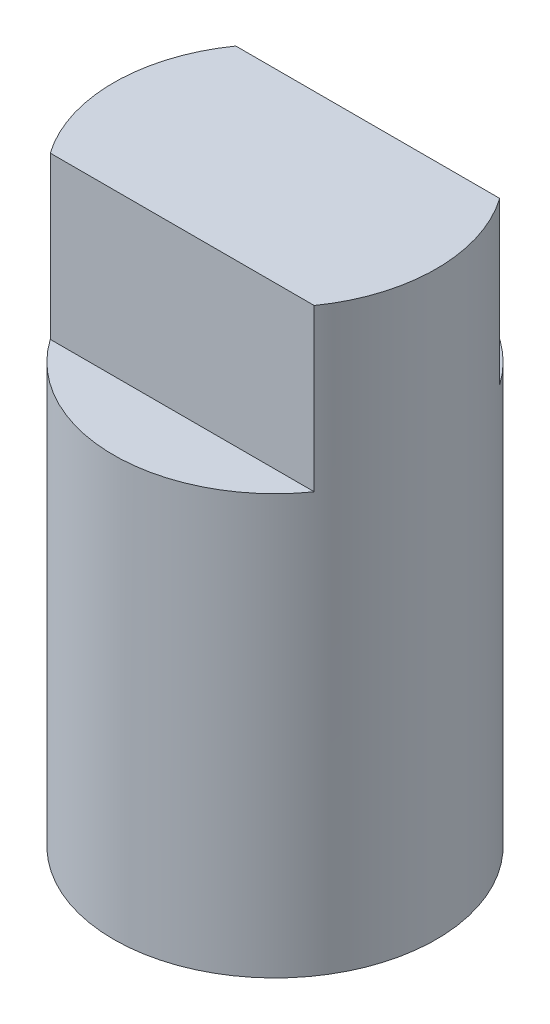
ISO-10303-21;
HEADER;
FILE_DESCRIPTION(('STEP AP214'),'2;1');
FILE_NAME('part.step','',(''),(''),'','','');
FILE_SCHEMA(('AUTOMOTIVE_DESIGN { 1 0 10303 214 1 1 1 1 }'));
ENDSEC;
DATA;
#1=APPLICATION_CONTEXT('core data for automotive mechanical design processes');
#2=APPLICATION_PROTOCOL_DEFINITION('international standard','automotive_design',2000,#1);
#3=PRODUCT_CONTEXT('',#1,'mechanical');
#4=PRODUCT('Part','Part','',(#3));
#5=PRODUCT_RELATED_PRODUCT_CATEGORY('part','',(#4));
#6=PRODUCT_DEFINITION_FORMATION('','',#4);
#7=PRODUCT_DEFINITION_CONTEXT('part definition',#1,'design');
#8=PRODUCT_DEFINITION('design','',#6,#7);
#9=PRODUCT_DEFINITION_SHAPE('','',#8);
#10=(LENGTH_UNIT() NAMED_UNIT(*) SI_UNIT(.MILLI.,.METRE.));
#11=(NAMED_UNIT(*) PLANE_ANGLE_UNIT() SI_UNIT($,.RADIAN.));
#12=(NAMED_UNIT(*) SI_UNIT($,.STERADIAN.) SOLID_ANGLE_UNIT());
#13=UNCERTAINTY_MEASURE_WITH_UNIT(LENGTH_MEASURE(1.E-05),#10,'distance_accuracy_value','');
#14=(GEOMETRIC_REPRESENTATION_CONTEXT(3) GLOBAL_UNCERTAINTY_ASSIGNED_CONTEXT((#13)) GLOBAL_UNIT_ASSIGNED_CONTEXT((#10,
#11,#12)) REPRESENTATION_CONTEXT('',''));
#15=CARTESIAN_POINT('',(0.,0.,0.));
#16=DIRECTION('',(0.,0.,1.));
#17=DIRECTION('',(1.,0.,0.));
#18=AXIS2_PLACEMENT_3D('',#15,#16,#17);
#19=CARTESIAN_POINT('',(0.,91.44,0.));
#20=DIRECTION('',(0.,-1.,0.));
#21=DIRECTION('',(0.,0.,-1.));
#22=AXIS2_PLACEMENT_3D('',#19,#20,#21);
#23=CYLINDRICAL_SURFACE('',#22,25.4);
#24=CARTESIAN_POINT('',(0.,91.44,0.));
#25=DIRECTION('',(0.,1.,0.));
#26=DIRECTION('',(0.,0.,1.));
#27=AXIS2_PLACEMENT_3D('',#24,#25,#26);
#28=CIRCLE('',#27,25.4);
#29=CARTESIAN_POINT('',(20.781096578381,91.44,14.605));
#30=VERTEX_POINT('',#29);
#31=CARTESIAN_POINT('',(20.781096578381,91.44,-14.605));
#32=VERTEX_POINT('',#31);
#33=EDGE_CURVE('E11',#30,#32,#28,.T.);
#34=ORIENTED_EDGE('',*,*,#33,.F.);
#35=DIRECTION('',(0.,-1.,0.));
#36=VECTOR('',#35,1.);
#37=CARTESIAN_POINT('',(20.781096578381,91.44,14.605));
#38=LINE('',#37,#36);
#39=CARTESIAN_POINT('',(20.781096578381,66.04,14.605));
#40=VERTEX_POINT('',#39);
#41=EDGE_CURVE('E62',#40,#30,#38,.F.);
#42=ORIENTED_EDGE('',*,*,#41,.F.);
#43=CARTESIAN_POINT('',(0.,66.04,0.));
#44=DIRECTION('',(0.,-1.,0.));
#45=DIRECTION('',(0.,0.,-1.));
#46=AXIS2_PLACEMENT_3D('',#43,#44,#45);
#47=CIRCLE('',#46,25.4);
#48=CARTESIAN_POINT('',(-20.781096578381,66.04,14.605));
#49=VERTEX_POINT('',#48);
#50=EDGE_CURVE('E93',#49,#40,#47,.F.);
#51=ORIENTED_EDGE('',*,*,#50,.F.);
#52=DIRECTION('',(0.,-1.,0.));
#53=VECTOR('',#52,1.);
#54=CARTESIAN_POINT('',(-20.781096578381,91.44,14.605));
#55=LINE('',#54,#53);
#56=CARTESIAN_POINT('',(-20.781096578381,91.44,14.605));
#57=VERTEX_POINT('',#56);
#58=EDGE_CURVE('E83',#57,#49,#55,.T.);
#59=ORIENTED_EDGE('',*,*,#58,.F.);
#60=CARTESIAN_POINT('',(-20.781096578381,91.44,-14.605));
#61=VERTEX_POINT('',#60);
#62=EDGE_CURVE('E47',#61,#57,#28,.T.);
#63=ORIENTED_EDGE('',*,*,#62,.F.);
#64=DIRECTION('',(0.,-1.,0.));
#65=VECTOR('',#64,1.);
#66=CARTESIAN_POINT('',(-20.781096578381,91.44,-14.605));
#67=LINE('',#66,#65);
#68=CARTESIAN_POINT('',(-20.781096578381,66.04,-14.605));
#69=VERTEX_POINT('',#68);
#70=EDGE_CURVE('E54',#69,#61,#67,.F.);
#71=ORIENTED_EDGE('',*,*,#70,.F.);
#72=CARTESIAN_POINT('',(0.,66.04,0.));
#73=DIRECTION('',(0.,-1.,0.));
#74=DIRECTION('',(0.,0.,-1.));
#75=AXIS2_PLACEMENT_3D('',#72,#73,#74);
#76=CIRCLE('',#75,25.4);
#77=CARTESIAN_POINT('',(20.781096578381,66.04,-14.605));
#78=VERTEX_POINT('',#77);
#79=EDGE_CURVE('E105',#78,#69,#76,.F.);
#80=ORIENTED_EDGE('',*,*,#79,.F.);
#81=DIRECTION('',(0.,-1.,0.));
#82=VECTOR('',#81,1.);
#83=CARTESIAN_POINT('',(20.781096578381,91.44,-14.605));
#84=LINE('',#83,#82);
#85=EDGE_CURVE('E99',#32,#78,#84,.T.);
#86=ORIENTED_EDGE('',*,*,#85,.F.);
#87=EDGE_LOOP('',(#34,#42,#51,#59,#63,#71,#80,#86));
#88=FACE_BOUND('',#87,.T.);
#89=CARTESIAN_POINT('',(0.,0.,0.));
#90=DIRECTION('',(0.,1.,0.));
#91=DIRECTION('',(0.,0.,1.));
#92=AXIS2_PLACEMENT_3D('',#89,#90,#91);
#93=CIRCLE('',#92,25.4);
#94=CARTESIAN_POINT('',(0.,0.,25.4));
#95=VERTEX_POINT('',#94);
#96=EDGE_CURVE('E42',#95,#95,#93,.T.);
#97=ORIENTED_EDGE('',*,*,#96,.T.);
#98=EDGE_LOOP('',(#97));
#99=FACE_BOUND('',#98,.T.);
#100=ADVANCED_FACE('F39',(#88,#99),#23,.T.);
#101=CARTESIAN_POINT('',(0.,91.44,0.));
#102=DIRECTION('',(0.,1.,0.));
#103=DIRECTION('',(0.,0.,1.));
#104=AXIS2_PLACEMENT_3D('',#101,#102,#103);
#105=PLANE('',#104);
#106=DIRECTION('',(1.,0.,0.));
#107=VECTOR('',#106,1.);
#108=CARTESIAN_POINT('',(-25.401,91.44,14.605));
#109=LINE('',#108,#107);
#110=EDGE_CURVE('E80',#57,#30,#109,.T.);
#111=ORIENTED_EDGE('',*,*,#110,.T.);
#112=ORIENTED_EDGE('',*,*,#33,.T.);
#113=DIRECTION('',(1.,0.,0.));
#114=VECTOR('',#113,1.);
#115=CARTESIAN_POINT('',(-25.401,91.44,-14.605));
#116=LINE('',#115,#114);
#117=EDGE_CURVE('E96',#61,#32,#116,.T.);
#118=ORIENTED_EDGE('',*,*,#117,.F.);
#119=ORIENTED_EDGE('',*,*,#62,.T.);
#120=EDGE_LOOP('',(#111,#112,#118,#119));
#121=FACE_BOUND('',#120,.T.);
#122=ADVANCED_FACE('F95',(#121),#105,.T.);
#123=CARTESIAN_POINT('',(0.,0.,0.));
#124=DIRECTION('',(0.,1.,0.));
#125=DIRECTION('',(0.,0.,1.));
#126=AXIS2_PLACEMENT_3D('',#123,#124,#125);
#127=PLANE('',#126);
#128=ORIENTED_EDGE('',*,*,#96,.F.);
#129=EDGE_LOOP('',(#128));
#130=FACE_BOUND('',#129,.T.);
#131=ADVANCED_FACE('F124',(#130),#127,.F.);
#132=CARTESIAN_POINT('',(-25.401,91.44,-14.605));
#133=DIRECTION('',(0.,0.,1.));
#134=DIRECTION('',(1.,0.,0.));
#135=AXIS2_PLACEMENT_3D('',#132,#133,#134);
#136=PLANE('',#135);
#137=ORIENTED_EDGE('',*,*,#70,.T.);
#138=ORIENTED_EDGE('',*,*,#117,.T.);
#139=ORIENTED_EDGE('',*,*,#85,.T.);
#140=DIRECTION('',(1.,0.,0.));
#141=VECTOR('',#140,1.);
#142=CARTESIAN_POINT('',(-25.401,66.04,-14.605));
#143=LINE('',#142,#141);
#144=EDGE_CURVE('E103',#69,#78,#143,.T.);
#145=ORIENTED_EDGE('',*,*,#144,.F.);
#146=EDGE_LOOP('',(#137,#138,#139,#145));
#147=FACE_BOUND('',#146,.T.);
#148=ADVANCED_FACE('F114',(#147),#136,.F.);
#149=CARTESIAN_POINT('',(-25.401,66.04,-14.605));
#150=DIRECTION('',(0.,-1.,0.));
#151=DIRECTION('',(0.,0.,-1.));
#152=AXIS2_PLACEMENT_3D('',#149,#150,#151);
#153=PLANE('',#152);
#154=ORIENTED_EDGE('',*,*,#144,.T.);
#155=ORIENTED_EDGE('',*,*,#79,.T.);
#156=EDGE_LOOP('',(#154,#155));
#157=FACE_BOUND('',#156,.T.);
#158=ADVANCED_FACE('F116',(#157),#153,.F.);
#159=CARTESIAN_POINT('',(-25.401,91.44,14.605));
#160=DIRECTION('',(0.,0.,-1.));
#161=DIRECTION('',(-1.,0.,0.));
#162=AXIS2_PLACEMENT_3D('',#159,#160,#161);
#163=PLANE('',#162);
#164=ORIENTED_EDGE('',*,*,#41,.T.);
#165=ORIENTED_EDGE('',*,*,#110,.F.);
#166=ORIENTED_EDGE('',*,*,#58,.T.);
#167=DIRECTION('',(1.,0.,0.));
#168=VECTOR('',#167,1.);
#169=CARTESIAN_POINT('',(-25.401,66.04,14.605));
#170=LINE('',#169,#168);
#171=EDGE_CURVE('E88',#49,#40,#170,.T.);
#172=ORIENTED_EDGE('',*,*,#171,.T.);
#173=EDGE_LOOP('',(#164,#165,#166,#172));
#174=FACE_BOUND('',#173,.T.);
#175=ADVANCED_FACE('F82',(#174),#163,.F.);
#176=CARTESIAN_POINT('',(-25.401,66.04,14.605));
#177=DIRECTION('',(0.,-1.,0.));
#178=DIRECTION('',(0.,0.,-1.));
#179=AXIS2_PLACEMENT_3D('',#176,#177,#178);
#180=PLANE('',#179);
#181=ORIENTED_EDGE('',*,*,#50,.T.);
#182=ORIENTED_EDGE('',*,*,#171,.F.);
#183=EDGE_LOOP('',(#181,#182));
#184=FACE_BOUND('',#183,.T.);
#185=ADVANCED_FACE('F111',(#184),#180,.F.);
#186=CLOSED_SHELL('',(#100,#122,#131,#148,#158,#175,#185));
#187=MANIFOLD_SOLID_BREP('B2',#186);
#188=ADVANCED_BREP_SHAPE_REPRESENTATION('',(#18,#187),#14);
#189=SHAPE_DEFINITION_REPRESENTATION(#9,#188);
ENDSEC;
END-ISO-10303-21;
